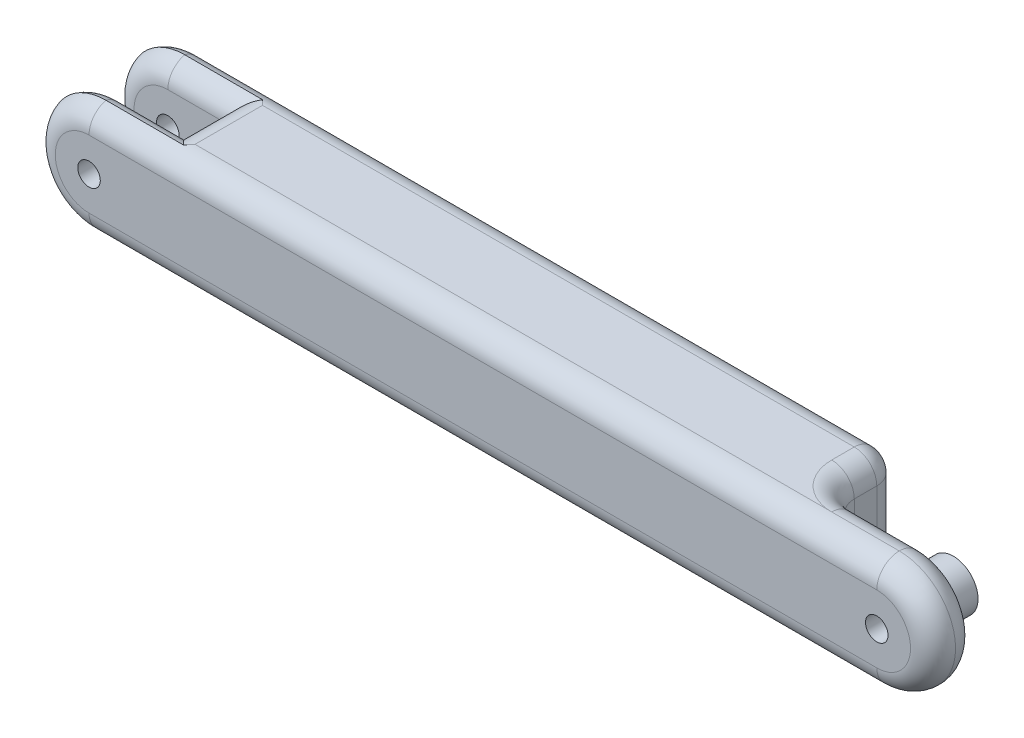
ISO-10303-21;
HEADER;
FILE_DESCRIPTION(('STEP AP214'),'2;1');
FILE_NAME('part.step','',(''),(''),'','','');
FILE_SCHEMA(('AUTOMOTIVE_DESIGN { 1 0 10303 214 1 1 1 1 }'));
ENDSEC;
DATA;
#1=APPLICATION_CONTEXT('core data for automotive mechanical design processes');
#2=APPLICATION_PROTOCOL_DEFINITION('international standard','automotive_design',2000,#1);
#3=PRODUCT_CONTEXT('',#1,'mechanical');
#4=PRODUCT('Part','Part','',(#3));
#5=PRODUCT_RELATED_PRODUCT_CATEGORY('part','',(#4));
#6=PRODUCT_DEFINITION_FORMATION('','',#4);
#7=PRODUCT_DEFINITION_CONTEXT('part definition',#1,'design');
#8=PRODUCT_DEFINITION('design','',#6,#7);
#9=PRODUCT_DEFINITION_SHAPE('','',#8);
#10=(LENGTH_UNIT() NAMED_UNIT(*) SI_UNIT(.MILLI.,.METRE.));
#11=(NAMED_UNIT(*) PLANE_ANGLE_UNIT() SI_UNIT($,.RADIAN.));
#12=(NAMED_UNIT(*) SI_UNIT($,.STERADIAN.) SOLID_ANGLE_UNIT());
#13=UNCERTAINTY_MEASURE_WITH_UNIT(LENGTH_MEASURE(1.E-05),#10,'distance_accuracy_value','');
#14=(GEOMETRIC_REPRESENTATION_CONTEXT(3) GLOBAL_UNCERTAINTY_ASSIGNED_CONTEXT((#13)) GLOBAL_UNIT_ASSIGNED_CONTEXT((#10,
#11,#12)) REPRESENTATION_CONTEXT('',''));
#15=CARTESIAN_POINT('',(0.,0.,0.));
#16=DIRECTION('',(0.,0.,1.));
#17=DIRECTION('',(1.,0.,0.));
#18=AXIS2_PLACEMENT_3D('',#15,#16,#17);
#19=CARTESIAN_POINT('',(0.,0.,3.));
#20=DIRECTION('',(0.,0.,-1.));
#21=DIRECTION('',(-1.,0.,0.));
#22=AXIS2_PLACEMENT_3D('',#19,#20,#21);
#23=PLANE('',#22);
#24=DIRECTION('',(0.,1.,0.));
#25=VECTOR('',#24,1.);
#26=CARTESIAN_POINT('',(18.5,0.,3.));
#27=LINE('',#26,#25);
#28=CARTESIAN_POINT('',(18.5,-1.5,3.));
#29=VERTEX_POINT('',#28);
#30=CARTESIAN_POINT('',(18.5,1.5,3.));
#31=VERTEX_POINT('',#30);
#32=EDGE_CURVE('E410',#29,#31,#27,.T.);
#33=ORIENTED_EDGE('',*,*,#32,.T.);
#34=DIRECTION('',(1.,0.,0.));
#35=VECTOR('',#34,1.);
#36=CARTESIAN_POINT('',(21.5,1.5,3.));
#37=LINE('',#36,#35);
#38=CARTESIAN_POINT('',(21.5,1.5,3.));
#39=VERTEX_POINT('',#38);
#40=EDGE_CURVE('E416',#31,#39,#37,.T.);
#41=ORIENTED_EDGE('',*,*,#40,.T.);
#42=CARTESIAN_POINT('',(21.5,0.,3.));
#43=DIRECTION('',(0.,0.,-1.));
#44=DIRECTION('',(-1.,0.,0.));
#45=AXIS2_PLACEMENT_3D('',#42,#43,#44);
#46=CIRCLE('',#45,1.5);
#47=CARTESIAN_POINT('',(21.5,-1.5,3.));
#48=VERTEX_POINT('',#47);
#49=EDGE_CURVE('E414',#39,#48,#46,.T.);
#50=ORIENTED_EDGE('',*,*,#49,.T.);
#51=DIRECTION('',(-1.,0.,0.));
#52=VECTOR('',#51,1.);
#53=CARTESIAN_POINT('',(17.5,-1.5,3.));
#54=LINE('',#53,#52);
#55=EDGE_CURVE('E412',#48,#29,#54,.T.);
#56=ORIENTED_EDGE('',*,*,#55,.T.);
#57=EDGE_LOOP('',(#33,#41,#50,#56));
#58=FACE_BOUND('',#57,.T.);
#59=CARTESIAN_POINT('',(21.5,0.,3.));
#60=DIRECTION('',(0.,0.,-1.));
#61=DIRECTION('',(-1.,0.,0.));
#62=AXIS2_PLACEMENT_3D('',#59,#60,#61);
#63=CIRCLE('',#62,1.1);
#64=CARTESIAN_POINT('',(20.4,0.,3.));
#65=VERTEX_POINT('',#64);
#66=EDGE_CURVE('E362',#65,#65,#63,.T.);
#67=ORIENTED_EDGE('',*,*,#66,.F.);
#68=EDGE_LOOP('',(#67));
#69=FACE_BOUND('',#68,.T.);
#70=ADVANCED_FACE('F37',(#58,#69),#23,.T.);
#71=CARTESIAN_POINT('',(21.5,0.,5.));
#72=DIRECTION('',(0.,0.,-1.));
#73=DIRECTION('',(-1.,0.,0.));
#74=AXIS2_PLACEMENT_3D('',#71,#72,#73);
#75=CYLINDRICAL_SURFACE('',#74,0.499999999999999);
#76=CARTESIAN_POINT('',(21.5,0.,5.));
#77=DIRECTION('',(0.,0.,1.));
#78=DIRECTION('',(1.,0.,0.));
#79=AXIS2_PLACEMENT_3D('',#76,#77,#78);
#80=CIRCLE('',#79,0.499999999999999);
#81=CARTESIAN_POINT('',(22.,0.,5.));
#82=VERTEX_POINT('',#81);
#83=EDGE_CURVE('E377',#82,#82,#80,.T.);
#84=ORIENTED_EDGE('',*,*,#83,.T.);
#85=EDGE_LOOP('',(#84));
#86=FACE_BOUND('',#85,.T.);
#87=CARTESIAN_POINT('',(21.5,0.,1.6));
#88=DIRECTION('',(0.,0.,-1.));
#89=DIRECTION('',(-1.,0.,0.));
#90=AXIS2_PLACEMENT_3D('',#87,#88,#89);
#91=CIRCLE('',#90,0.499999999999999);
#92=CARTESIAN_POINT('',(21.,0.,1.6));
#93=VERTEX_POINT('',#92);
#94=EDGE_CURVE('E360',#93,#93,#91,.T.);
#95=ORIENTED_EDGE('',*,*,#94,.T.);
#96=EDGE_LOOP('',(#95));
#97=FACE_BOUND('',#96,.T.);
#98=ADVANCED_FACE('F529',(#86,#97),#75,.F.);
#99=CARTESIAN_POINT('',(-13.5,0.,5.));
#100=DIRECTION('',(0.,0.,-1.));
#101=DIRECTION('',(-1.,0.,0.));
#102=AXIS2_PLACEMENT_3D('',#99,#100,#101);
#103=CYLINDRICAL_SURFACE('',#102,0.500000000000001);
#104=CARTESIAN_POINT('',(-13.5,0.,5.));
#105=DIRECTION('',(0.,0.,1.));
#106=DIRECTION('',(1.,0.,0.));
#107=AXIS2_PLACEMENT_3D('',#104,#105,#106);
#108=CIRCLE('',#107,0.500000000000001);
#109=CARTESIAN_POINT('',(-13.,0.,5.));
#110=VERTEX_POINT('',#109);
#111=EDGE_CURVE('E382',#110,#110,#108,.T.);
#112=ORIENTED_EDGE('',*,*,#111,.T.);
#113=EDGE_LOOP('',(#112));
#114=FACE_BOUND('',#113,.T.);
#115=CARTESIAN_POINT('',(-13.5,0.,3.5));
#116=DIRECTION('',(0.,0.,-1.));
#117=DIRECTION('',(-1.,0.,0.));
#118=AXIS2_PLACEMENT_3D('',#115,#116,#117);
#119=CIRCLE('',#118,0.500000000000001);
#120=CARTESIAN_POINT('',(-14.,0.,3.5));
#121=VERTEX_POINT('',#120);
#122=EDGE_CURVE('E376',#121,#121,#119,.T.);
#123=ORIENTED_EDGE('',*,*,#122,.T.);
#124=EDGE_LOOP('',(#123));
#125=FACE_BOUND('',#124,.T.);
#126=ADVANCED_FACE('F535',(#114,#125),#103,.F.);
#127=CARTESIAN_POINT('',(21.5,0.,5.));
#128=DIRECTION('',(0.,0.,1.));
#129=DIRECTION('',(1.,0.,0.));
#130=AXIS2_PLACEMENT_3D('',#127,#128,#129);
#131=PLANE('',#130);
#132=DIRECTION('',(-1.,0.,0.));
#133=VECTOR('',#132,1.);
#134=CARTESIAN_POINT('',(-13.5,1.5,5.));
#135=LINE('',#134,#133);
#136=CARTESIAN_POINT('',(21.5,1.5,5.));
#137=VERTEX_POINT('',#136);
#138=CARTESIAN_POINT('',(-13.5,1.5,5.));
#139=VERTEX_POINT('',#138);
#140=EDGE_CURVE('E435',#137,#139,#135,.T.);
#141=ORIENTED_EDGE('',*,*,#140,.T.);
#142=CARTESIAN_POINT('',(-13.5,0.,5.));
#143=DIRECTION('',(0.,0.,1.));
#144=DIRECTION('',(1.,0.,0.));
#145=AXIS2_PLACEMENT_3D('',#142,#143,#144);
#146=CIRCLE('',#145,1.5);
#147=CARTESIAN_POINT('',(-13.5,-1.5,5.));
#148=VERTEX_POINT('',#147);
#149=EDGE_CURVE('E437',#139,#148,#146,.T.);
#150=ORIENTED_EDGE('',*,*,#149,.T.);
#151=DIRECTION('',(1.,0.,0.));
#152=VECTOR('',#151,1.);
#153=CARTESIAN_POINT('',(21.5,-1.5,5.));
#154=LINE('',#153,#152);
#155=CARTESIAN_POINT('',(21.5,-1.5,5.));
#156=VERTEX_POINT('',#155);
#157=EDGE_CURVE('E431',#148,#156,#154,.T.);
#158=ORIENTED_EDGE('',*,*,#157,.T.);
#159=CARTESIAN_POINT('',(21.5,0.,5.));
#160=DIRECTION('',(0.,0.,1.));
#161=DIRECTION('',(1.,0.,0.));
#162=AXIS2_PLACEMENT_3D('',#159,#160,#161);
#163=CIRCLE('',#162,1.5);
#164=EDGE_CURVE('E433',#156,#137,#163,.T.);
#165=ORIENTED_EDGE('',*,*,#164,.T.);
#166=EDGE_LOOP('',(#141,#150,#158,#165));
#167=FACE_BOUND('',#166,.T.);
#168=ORIENTED_EDGE('',*,*,#111,.F.);
#169=EDGE_LOOP('',(#168));
#170=FACE_BOUND('',#169,.T.);
#171=ORIENTED_EDGE('',*,*,#83,.F.);
#172=EDGE_LOOP('',(#171));
#173=FACE_BOUND('',#172,.T.);
#174=ADVANCED_FACE('F503',(#167,#170,#173),#131,.T.);
#175=CARTESIAN_POINT('',(21.5,0.,0.));
#176=DIRECTION('',(0.,0.,1.));
#177=DIRECTION('',(1.,0.,0.));
#178=AXIS2_PLACEMENT_3D('',#175,#176,#177);
#179=PLANE('',#178);
#180=CARTESIAN_POINT('',(-13.5,0.,0.));
#181=DIRECTION('',(0.,0.,1.));
#182=DIRECTION('',(1.,0.,0.));
#183=AXIS2_PLACEMENT_3D('',#180,#181,#182);
#184=CIRCLE('',#183,1.5);
#185=CARTESIAN_POINT('',(-13.5,-1.5,0.));
#186=VERTEX_POINT('',#185);
#187=CARTESIAN_POINT('',(-13.5,1.5,0.));
#188=VERTEX_POINT('',#187);
#189=EDGE_CURVE('E444',#186,#188,#184,.F.);
#190=ORIENTED_EDGE('',*,*,#189,.T.);
#191=DIRECTION('',(-1.,0.,0.));
#192=VECTOR('',#191,1.);
#193=CARTESIAN_POINT('',(21.5,1.5,0.));
#194=LINE('',#193,#192);
#195=CARTESIAN_POINT('',(16.5,1.5,0.));
#196=VERTEX_POINT('',#195);
#197=EDGE_CURVE('E446',#188,#196,#194,.F.);
#198=ORIENTED_EDGE('',*,*,#197,.T.);
#199=DIRECTION('',(0.,1.,0.));
#200=VECTOR('',#199,1.);
#201=CARTESIAN_POINT('',(16.5,0.,0.));
#202=LINE('',#201,#200);
#203=CARTESIAN_POINT('',(16.5,-1.5,0.));
#204=VERTEX_POINT('',#203);
#205=EDGE_CURVE('E440',#196,#204,#202,.F.);
#206=ORIENTED_EDGE('',*,*,#205,.T.);
#207=DIRECTION('',(1.,0.,0.));
#208=VECTOR('',#207,1.);
#209=CARTESIAN_POINT('',(21.5,-1.5,0.));
#210=LINE('',#209,#208);
#211=EDGE_CURVE('E442',#204,#186,#210,.F.);
#212=ORIENTED_EDGE('',*,*,#211,.T.);
#213=EDGE_LOOP('',(#190,#198,#206,#212));
#214=FACE_BOUND('',#213,.T.);
#215=CARTESIAN_POINT('',(-13.5,0.,0.));
#216=DIRECTION('',(0.,0.,1.));
#217=DIRECTION('',(1.,0.,0.));
#218=AXIS2_PLACEMENT_3D('',#215,#216,#217);
#219=CIRCLE('',#218,0.500000000000001);
#220=CARTESIAN_POINT('',(-13.,0.,0.));
#221=VERTEX_POINT('',#220);
#222=EDGE_CURVE('E380',#221,#221,#219,.T.);
#223=ORIENTED_EDGE('',*,*,#222,.T.);
#224=EDGE_LOOP('',(#223));
#225=FACE_BOUND('',#224,.T.);
#226=ADVANCED_FACE('F560',(#214,#225),#179,.F.);
#227=CARTESIAN_POINT('',(-13.5,2.5,5.));
#228=DIRECTION('',(0.,-1.,0.));
#229=DIRECTION('',(1.,0.,0.));
#230=AXIS2_PLACEMENT_3D('',#227,#228,#229);
#231=PLANE('',#230);
#232=CARTESIAN_POINT('',(18.5,2.5,2.));
#233=DIRECTION('',(0.,-1.,0.));
#234=DIRECTION('',(1.,0.,0.));
#235=AXIS2_PLACEMENT_3D('',#232,#233,#234);
#236=CIRCLE('',#235,2.);
#237=CARTESIAN_POINT('',(16.5,2.5,2.));
#238=VERTEX_POINT('',#237);
#239=CARTESIAN_POINT('',(18.5,2.5,4.));
#240=VERTEX_POINT('',#239);
#241=EDGE_CURVE('E396',#238,#240,#236,.F.);
#242=ORIENTED_EDGE('',*,*,#241,.F.);
#243=DIRECTION('',(0.,0.,-1.));
#244=VECTOR('',#243,1.);
#245=CARTESIAN_POINT('',(16.5,2.5,5.));
#246=LINE('',#245,#244);
#247=CARTESIAN_POINT('',(16.5,2.5,1.));
#248=VERTEX_POINT('',#247);
#249=EDGE_CURVE('E399',#238,#248,#246,.T.);
#250=ORIENTED_EDGE('',*,*,#249,.T.);
#251=DIRECTION('',(-1.,0.,0.));
#252=VECTOR('',#251,1.);
#253=CARTESIAN_POINT('',(-13.5,2.5,1.));
#254=LINE('',#253,#252);
#255=CARTESIAN_POINT('',(-9.79190075645216,2.5,1.));
#256=VERTEX_POINT('',#255);
#257=EDGE_CURVE('E104',#248,#256,#254,.T.);
#258=ORIENTED_EDGE('',*,*,#257,.T.);
#259=DIRECTION('',(0.,0.,-1.));
#260=VECTOR('',#259,1.);
#261=CARTESIAN_POINT('',(-9.79190075645216,2.5,3.5));
#262=LINE('',#261,#260);
#263=CARTESIAN_POINT('',(-9.79190075645216,2.5,4.));
#264=VERTEX_POINT('',#263);
#265=EDGE_CURVE('E385',#256,#264,#262,.F.);
#266=ORIENTED_EDGE('',*,*,#265,.T.);
#267=DIRECTION('',(-1.,0.,0.));
#268=VECTOR('',#267,1.);
#269=CARTESIAN_POINT('',(21.5,2.5,4.));
#270=LINE('',#269,#268);
#271=EDGE_CURVE('E394',#264,#240,#270,.F.);
#272=ORIENTED_EDGE('',*,*,#271,.T.);
#273=EDGE_LOOP('',(#242,#250,#258,#266,#272));
#274=FACE_BOUND('',#273,.T.);
#275=ADVANCED_FACE('F563',(#274),#231,.F.);
#276=CARTESIAN_POINT('',(-13.5,-2.5,5.));
#277=DIRECTION('',(0.,1.,0.));
#278=DIRECTION('',(0.,0.,1.));
#279=AXIS2_PLACEMENT_3D('',#276,#277,#278);
#280=PLANE('',#279);
#281=CARTESIAN_POINT('',(18.5,-2.5,2.));
#282=DIRECTION('',(0.,1.,0.));
#283=DIRECTION('',(0.,0.,1.));
#284=AXIS2_PLACEMENT_3D('',#281,#282,#283);
#285=CIRCLE('',#284,2.);
#286=CARTESIAN_POINT('',(18.5,-2.5,4.));
#287=VERTEX_POINT('',#286);
#288=CARTESIAN_POINT('',(16.5,-2.5,2.));
#289=VERTEX_POINT('',#288);
#290=EDGE_CURVE('E460',#287,#289,#285,.F.);
#291=ORIENTED_EDGE('',*,*,#290,.F.);
#292=DIRECTION('',(1.,0.,0.));
#293=VECTOR('',#292,1.);
#294=CARTESIAN_POINT('',(-13.5,-2.5,4.));
#295=LINE('',#294,#293);
#296=CARTESIAN_POINT('',(-9.79190075645215,-2.5,4.));
#297=VERTEX_POINT('',#296);
#298=EDGE_CURVE('E249',#287,#297,#295,.F.);
#299=ORIENTED_EDGE('',*,*,#298,.T.);
#300=DIRECTION('',(0.,0.,-1.));
#301=VECTOR('',#300,1.);
#302=CARTESIAN_POINT('',(-9.79190075645215,-2.5,1.5));
#303=LINE('',#302,#301);
#304=CARTESIAN_POINT('',(-9.79190075645215,-2.5,1.));
#305=VERTEX_POINT('',#304);
#306=EDGE_CURVE('E457',#297,#305,#303,.T.);
#307=ORIENTED_EDGE('',*,*,#306,.T.);
#308=DIRECTION('',(1.,0.,0.));
#309=VECTOR('',#308,1.);
#310=CARTESIAN_POINT('',(-13.5,-2.5,1.));
#311=LINE('',#310,#309);
#312=CARTESIAN_POINT('',(16.5,-2.5,1.));
#313=VERTEX_POINT('',#312);
#314=EDGE_CURVE('E453',#305,#313,#311,.T.);
#315=ORIENTED_EDGE('',*,*,#314,.T.);
#316=DIRECTION('',(0.,0.,-1.));
#317=VECTOR('',#316,1.);
#318=CARTESIAN_POINT('',(16.5,-2.5,5.));
#319=LINE('',#318,#317);
#320=EDGE_CURVE('E455',#313,#289,#319,.F.);
#321=ORIENTED_EDGE('',*,*,#320,.T.);
#322=EDGE_LOOP('',(#291,#299,#307,#315,#321));
#323=FACE_BOUND('',#322,.T.);
#324=ADVANCED_FACE('F464',(#323),#280,.F.);
#325=CARTESIAN_POINT('',(-13.5,0.,1.5));
#326=DIRECTION('',(0.,0.,-1.));
#327=DIRECTION('',(-1.,0.,0.));
#328=AXIS2_PLACEMENT_3D('',#325,#326,#327);
#329=CIRCLE('',#328,0.500000000000001);
#330=CARTESIAN_POINT('',(-14.,0.,1.5));
#331=VERTEX_POINT('',#330);
#332=EDGE_CURVE('E381',#331,#331,#329,.T.);
#333=ORIENTED_EDGE('',*,*,#332,.F.);
#334=EDGE_LOOP('',(#333));
#335=FACE_BOUND('',#334,.T.);
#336=ORIENTED_EDGE('',*,*,#222,.F.);
#337=EDGE_LOOP('',(#336));
#338=FACE_BOUND('',#337,.T.);
#339=ADVANCED_FACE('F552',(#335,#338),#103,.F.);
#340=CARTESIAN_POINT('',(-13.5,0.,1.5));
#341=DIRECTION('',(0.,0.,1.));
#342=DIRECTION('',(1.,0.,0.));
#343=AXIS2_PLACEMENT_3D('',#340,#341,#342);
#344=CYLINDRICAL_SURFACE('',#343,3.);
#345=CARTESIAN_POINT('',(-13.5,0.,3.5));
#346=DIRECTION('',(0.,0.,-1.));
#347=DIRECTION('',(-1.,0.,0.));
#348=AXIS2_PLACEMENT_3D('',#345,#346,#347);
#349=CIRCLE('',#348,3.);
#350=CARTESIAN_POINT('',(-10.7189255673391,1.125,3.5));
#351=VERTEX_POINT('',#350);
#352=CARTESIAN_POINT('',(-10.7189255673391,-1.125,3.5));
#353=VERTEX_POINT('',#352);
#354=EDGE_CURVE('E371',#351,#353,#349,.T.);
#355=ORIENTED_EDGE('',*,*,#354,.F.);
#356=DIRECTION('',(0.,0.,1.));
#357=VECTOR('',#356,1.);
#358=CARTESIAN_POINT('',(-10.7189255673391,1.125,1.5));
#359=LINE('',#358,#357);
#360=CARTESIAN_POINT('',(-10.7189255673391,1.125,1.5));
#361=VERTEX_POINT('',#360);
#362=EDGE_CURVE('E451',#351,#361,#359,.F.);
#363=ORIENTED_EDGE('',*,*,#362,.T.);
#364=CARTESIAN_POINT('',(-13.5,0.,1.5));
#365=DIRECTION('',(0.,0.,-1.));
#366=DIRECTION('',(-1.,0.,0.));
#367=AXIS2_PLACEMENT_3D('',#364,#365,#366);
#368=CIRCLE('',#367,3.);
#369=CARTESIAN_POINT('',(-10.7189255673391,-1.125,1.5));
#370=VERTEX_POINT('',#369);
#371=EDGE_CURVE('E226',#361,#370,#368,.T.);
#372=ORIENTED_EDGE('',*,*,#371,.T.);
#373=DIRECTION('',(0.,0.,1.));
#374=VECTOR('',#373,1.);
#375=CARTESIAN_POINT('',(-10.7189255673391,-1.125,1.5));
#376=LINE('',#375,#374);
#377=EDGE_CURVE('E449',#370,#353,#376,.T.);
#378=ORIENTED_EDGE('',*,*,#377,.T.);
#379=EDGE_LOOP('',(#355,#363,#372,#378));
#380=FACE_BOUND('',#379,.T.);
#381=ADVANCED_FACE('F549',(#380),#344,.F.);
#382=CARTESIAN_POINT('',(-13.5,0.,1.5));
#383=DIRECTION('',(0.,0.,-1.));
#384=DIRECTION('',(-1.,0.,0.));
#385=AXIS2_PLACEMENT_3D('',#382,#383,#384);
#386=PLANE('',#385);
#387=ORIENTED_EDGE('',*,*,#332,.T.);
#388=EDGE_LOOP('',(#387));
#389=FACE_BOUND('',#388,.T.);
#390=CARTESIAN_POINT('',(-13.5,0.,1.5));
#391=DIRECTION('',(0.,0.,-1.));
#392=DIRECTION('',(-1.,0.,0.));
#393=AXIS2_PLACEMENT_3D('',#390,#391,#392);
#394=CIRCLE('',#393,1.5);
#395=CARTESIAN_POINT('',(-13.5,1.5,1.5));
#396=VERTEX_POINT('',#395);
#397=CARTESIAN_POINT('',(-13.5,-1.5,1.5));
#398=VERTEX_POINT('',#397);
#399=EDGE_CURVE('E419',#396,#398,#394,.F.);
#400=ORIENTED_EDGE('',*,*,#399,.T.);
#401=DIRECTION('',(-1.,0.,0.));
#402=VECTOR('',#401,1.);
#403=CARTESIAN_POINT('',(-13.5,-1.5,1.5));
#404=LINE('',#403,#402);
#405=CARTESIAN_POINT('',(-10.9019237886467,-1.5,1.5));
#406=VERTEX_POINT('',#405);
#407=EDGE_CURVE('E422',#398,#406,#404,.F.);
#408=ORIENTED_EDGE('',*,*,#407,.T.);
#409=DIRECTION('',(-1.,0.,0.));
#410=VECTOR('',#409,1.);
#411=CARTESIAN_POINT('',(-13.5,-1.5,1.5));
#412=LINE('',#411,#410);
#413=CARTESIAN_POINT('',(-10.7919007564522,-1.5,1.5));
#414=VERTEX_POINT('',#413);
#415=EDGE_CURVE('E246',#406,#414,#412,.F.);
#416=ORIENTED_EDGE('',*,*,#415,.T.);
#417=CARTESIAN_POINT('',(-9.79190075645215,-1.5,1.5));
#418=DIRECTION('',(0.,0.,-1.));
#419=DIRECTION('',(-1.,0.,0.));
#420=AXIS2_PLACEMENT_3D('',#417,#418,#419);
#421=CIRCLE('',#420,1.);
#422=EDGE_CURVE('E11',#414,#370,#421,.T.);
#423=ORIENTED_EDGE('',*,*,#422,.T.);
#424=ORIENTED_EDGE('',*,*,#371,.F.);
#425=CARTESIAN_POINT('',(-9.79190075645216,1.5,1.5));
#426=DIRECTION('',(0.,0.,-1.));
#427=DIRECTION('',(-1.,0.,0.));
#428=AXIS2_PLACEMENT_3D('',#425,#426,#427);
#429=CIRCLE('',#428,1.);
#430=CARTESIAN_POINT('',(-10.7919007564522,1.5,1.5));
#431=VERTEX_POINT('',#430);
#432=EDGE_CURVE('E219',#361,#431,#429,.T.);
#433=ORIENTED_EDGE('',*,*,#432,.T.);
#434=DIRECTION('',(1.,0.,0.));
#435=VECTOR('',#434,1.);
#436=CARTESIAN_POINT('',(-13.5,1.5,1.5));
#437=LINE('',#436,#435);
#438=CARTESIAN_POINT('',(-10.9019237886467,1.5,1.5));
#439=VERTEX_POINT('',#438);
#440=EDGE_CURVE('E223',#431,#439,#437,.F.);
#441=ORIENTED_EDGE('',*,*,#440,.T.);
#442=DIRECTION('',(1.,0.,0.));
#443=VECTOR('',#442,1.);
#444=CARTESIAN_POINT('',(-13.5,1.5,1.5));
#445=LINE('',#444,#443);
#446=EDGE_CURVE('E244',#439,#396,#445,.F.);
#447=ORIENTED_EDGE('',*,*,#446,.T.);
#448=EDGE_LOOP('',(#400,#408,#416,#423,#424,#433,#441,#447));
#449=FACE_BOUND('',#448,.T.);
#450=ADVANCED_FACE('F221',(#389,#449),#386,.F.);
#451=CARTESIAN_POINT('',(-13.5,0.,3.5));
#452=DIRECTION('',(0.,0.,-1.));
#453=DIRECTION('',(-1.,0.,0.));
#454=AXIS2_PLACEMENT_3D('',#451,#452,#453);
#455=PLANE('',#454);
#456=ORIENTED_EDGE('',*,*,#354,.T.);
#457=CARTESIAN_POINT('',(-9.79190075645215,-1.5,3.5));
#458=DIRECTION('',(0.,0.,-1.));
#459=DIRECTION('',(-1.,0.,0.));
#460=AXIS2_PLACEMENT_3D('',#457,#458,#459);
#461=CIRCLE('',#460,1.);
#462=CARTESIAN_POINT('',(-10.7919007564522,-1.5,3.5));
#463=VERTEX_POINT('',#462);
#464=EDGE_CURVE('E47',#353,#463,#461,.F.);
#465=ORIENTED_EDGE('',*,*,#464,.T.);
#466=DIRECTION('',(-1.,0.,0.));
#467=VECTOR('',#466,1.);
#468=CARTESIAN_POINT('',(-13.5,-1.5,3.5));
#469=LINE('',#468,#467);
#470=CARTESIAN_POINT('',(-10.9019237886467,-1.5,3.5));
#471=VERTEX_POINT('',#470);
#472=EDGE_CURVE('E245',#463,#471,#469,.T.);
#473=ORIENTED_EDGE('',*,*,#472,.T.);
#474=DIRECTION('',(-1.,0.,0.));
#475=VECTOR('',#474,1.);
#476=CARTESIAN_POINT('',(-13.5,-1.5,3.5));
#477=LINE('',#476,#475);
#478=CARTESIAN_POINT('',(-13.5,-1.5,3.5));
#479=VERTEX_POINT('',#478);
#480=EDGE_CURVE('E429',#471,#479,#477,.T.);
#481=ORIENTED_EDGE('',*,*,#480,.T.);
#482=CARTESIAN_POINT('',(-13.5,0.,3.5));
#483=DIRECTION('',(0.,0.,-1.));
#484=DIRECTION('',(-1.,0.,0.));
#485=AXIS2_PLACEMENT_3D('',#482,#483,#484);
#486=CIRCLE('',#485,1.5);
#487=CARTESIAN_POINT('',(-13.5,1.5,3.5));
#488=VERTEX_POINT('',#487);
#489=EDGE_CURVE('E425',#479,#488,#486,.T.);
#490=ORIENTED_EDGE('',*,*,#489,.T.);
#491=DIRECTION('',(1.,0.,0.));
#492=VECTOR('',#491,1.);
#493=CARTESIAN_POINT('',(-11.8416876048223,1.5,3.5));
#494=LINE('',#493,#492);
#495=CARTESIAN_POINT('',(-10.9019237886467,1.5,3.5));
#496=VERTEX_POINT('',#495);
#497=EDGE_CURVE('E427',#488,#496,#494,.T.);
#498=ORIENTED_EDGE('',*,*,#497,.T.);
#499=DIRECTION('',(1.,0.,0.));
#500=VECTOR('',#499,1.);
#501=CARTESIAN_POINT('',(-11.8416876048223,1.5,3.5));
#502=LINE('',#501,#500);
#503=CARTESIAN_POINT('',(-10.7919007564522,1.5,3.5));
#504=VERTEX_POINT('',#503);
#505=EDGE_CURVE('E56',#496,#504,#502,.T.);
#506=ORIENTED_EDGE('',*,*,#505,.T.);
#507=CARTESIAN_POINT('',(-9.79190075645216,1.5,3.5));
#508=DIRECTION('',(0.,0.,-1.));
#509=DIRECTION('',(-1.,0.,0.));
#510=AXIS2_PLACEMENT_3D('',#507,#508,#509);
#511=CIRCLE('',#510,1.);
#512=EDGE_CURVE('E229',#504,#351,#511,.F.);
#513=ORIENTED_EDGE('',*,*,#512,.T.);
#514=EDGE_LOOP('',(#456,#465,#473,#481,#490,#498,#506,#513));
#515=FACE_BOUND('',#514,.T.);
#516=ORIENTED_EDGE('',*,*,#122,.F.);
#517=EDGE_LOOP('',(#516));
#518=FACE_BOUND('',#517,.T.);
#519=ADVANCED_FACE('F515',(#515,#518),#455,.T.);
#520=CARTESIAN_POINT('',(17.5,2.5,3.));
#521=DIRECTION('',(-1.,0.,0.));
#522=DIRECTION('',(0.,0.,1.));
#523=AXIS2_PLACEMENT_3D('',#520,#521,#522);
#524=PLANE('',#523);
#525=DIRECTION('',(0.,0.,-1.));
#526=VECTOR('',#525,1.);
#527=CARTESIAN_POINT('',(17.5,1.5,3.));
#528=LINE('',#527,#526);
#529=CARTESIAN_POINT('',(17.5,1.5,1.));
#530=VERTEX_POINT('',#529);
#531=CARTESIAN_POINT('',(17.5,1.5,2.));
#532=VERTEX_POINT('',#531);
#533=EDGE_CURVE('E405',#530,#532,#528,.F.);
#534=ORIENTED_EDGE('',*,*,#533,.T.);
#535=DIRECTION('',(0.,1.,0.));
#536=VECTOR('',#535,1.);
#537=CARTESIAN_POINT('',(17.5,2.5,2.));
#538=LINE('',#537,#536);
#539=CARTESIAN_POINT('',(17.5,-1.5,2.));
#540=VERTEX_POINT('',#539);
#541=EDGE_CURVE('E408',#532,#540,#538,.F.);
#542=ORIENTED_EDGE('',*,*,#541,.T.);
#543=DIRECTION('',(0.,0.,-1.));
#544=VECTOR('',#543,1.);
#545=CARTESIAN_POINT('',(17.5,-1.5,3.));
#546=LINE('',#545,#544);
#547=CARTESIAN_POINT('',(17.5,-1.5,1.));
#548=VERTEX_POINT('',#547);
#549=EDGE_CURVE('E403',#540,#548,#546,.T.);
#550=ORIENTED_EDGE('',*,*,#549,.T.);
#551=DIRECTION('',(0.,1.,0.));
#552=VECTOR('',#551,1.);
#553=CARTESIAN_POINT('',(17.5,2.5,1.));
#554=LINE('',#553,#552);
#555=EDGE_CURVE('E401',#548,#530,#554,.T.);
#556=ORIENTED_EDGE('',*,*,#555,.T.);
#557=EDGE_LOOP('',(#534,#542,#550,#556));
#558=FACE_BOUND('',#557,.T.);
#559=ADVANCED_FACE('F541',(#558),#524,.F.);
#560=CARTESIAN_POINT('',(21.5,0.,1.6));
#561=DIRECTION('',(0.,0.,-1.));
#562=DIRECTION('',(-1.,0.,0.));
#563=AXIS2_PLACEMENT_3D('',#560,#561,#562);
#564=PLANE('',#563);
#565=CARTESIAN_POINT('',(21.5,0.,1.6));
#566=DIRECTION('',(0.,0.,-1.));
#567=DIRECTION('',(-1.,0.,0.));
#568=AXIS2_PLACEMENT_3D('',#565,#566,#567);
#569=CIRCLE('',#568,1.1);
#570=CARTESIAN_POINT('',(20.4,0.,1.6));
#571=VERTEX_POINT('',#570);
#572=EDGE_CURVE('E367',#571,#571,#569,.T.);
#573=ORIENTED_EDGE('',*,*,#572,.T.);
#574=EDGE_LOOP('',(#573));
#575=FACE_BOUND('',#574,.T.);
#576=ORIENTED_EDGE('',*,*,#94,.F.);
#577=EDGE_LOOP('',(#576));
#578=FACE_BOUND('',#577,.T.);
#579=ADVANCED_FACE('F525',(#575,#578),#564,.T.);
#580=CARTESIAN_POINT('',(21.5,0.,1.6));
#581=DIRECTION('',(0.,0.,1.));
#582=DIRECTION('',(1.,0.,0.));
#583=AXIS2_PLACEMENT_3D('',#580,#581,#582);
#584=CYLINDRICAL_SURFACE('',#583,1.1);
#585=ORIENTED_EDGE('',*,*,#572,.F.);
#586=EDGE_LOOP('',(#585));
#587=FACE_BOUND('',#586,.T.);
#588=ORIENTED_EDGE('',*,*,#66,.T.);
#589=EDGE_LOOP('',(#588));
#590=FACE_BOUND('',#589,.T.);
#591=ADVANCED_FACE('F520',(#587,#590),#584,.T.);
#592=CARTESIAN_POINT('',(-13.5,-1.5,4.5));
#593=DIRECTION('',(1.,0.,0.));
#594=DIRECTION('',(0.,0.,-1.));
#595=AXIS2_PLACEMENT_3D('',#592,#593,#594);
#596=CYLINDRICAL_SURFACE('',#595,1.);
#597=DIRECTION('',(1.,0.,0.));
#598=VECTOR('',#597,1.);
#599=CARTESIAN_POINT('',(-11.6348260804954,-2.46824583655185,4.25));
#600=LINE('',#599,#598);
#601=CARTESIAN_POINT('',(-13.5,-2.46824583655185,4.25));
#602=VERTEX_POINT('',#601);
#603=CARTESIAN_POINT('',(-10.0419007564522,-2.46824583655185,4.25));
#604=VERTEX_POINT('',#603);
#605=EDGE_CURVE('E41',#602,#604,#600,.T.);
#606=ORIENTED_EDGE('',*,*,#605,.F.);
#607=CARTESIAN_POINT('',(-13.5,-1.5,4.5));
#608=DIRECTION('',(-1.,0.,0.));
#609=DIRECTION('',(0.,0.,1.));
#610=AXIS2_PLACEMENT_3D('',#607,#608,#609);
#611=CIRCLE('',#610,1.);
#612=EDGE_CURVE('E357',#479,#602,#611,.T.);
#613=ORIENTED_EDGE('',*,*,#612,.F.);
#614=ORIENTED_EDGE('',*,*,#480,.F.);
#615=ORIENTED_EDGE('',*,*,#472,.F.);
#616=CARTESIAN_POINT('',(-9.79190075645215,-1.5,4.5));
#617=DIRECTION('',(0.707106781186547,0.,-0.707106781186547));
#618=DIRECTION('',(0.707106781186547,0.,0.707106781186547));
#619=AXIS2_PLACEMENT_3D('',#616,#617,#618);
#620=ELLIPSE('',#619,1.41421356237309,1.);
#621=EDGE_CURVE('E353',#604,#463,#620,.T.);
#622=ORIENTED_EDGE('',*,*,#621,.F.);
#623=EDGE_LOOP('',(#606,#613,#614,#615,#622));
#624=FACE_BOUND('',#623,.T.);
#625=ADVANCED_FACE('F39',(#624),#596,.T.);
#626=CARTESIAN_POINT('',(21.5,-1.5,4.));
#627=DIRECTION('',(-1.,0.,0.));
#628=DIRECTION('',(0.,0.,1.));
#629=AXIS2_PLACEMENT_3D('',#626,#627,#628);
#630=CYLINDRICAL_SURFACE('',#629,1.);
#631=CARTESIAN_POINT('',(-13.5,-1.5,4.));
#632=DIRECTION('',(-1.,0.,0.));
#633=DIRECTION('',(0.,0.,1.));
#634=AXIS2_PLACEMENT_3D('',#631,#632,#633);
#635=CIRCLE('',#634,1.);
#636=EDGE_CURVE('E342',#602,#148,#635,.T.);
#637=ORIENTED_EDGE('',*,*,#636,.F.);
#638=ORIENTED_EDGE('',*,*,#605,.T.);
#639=CARTESIAN_POINT('',(-9.79190075645215,-1.5,4.));
#640=DIRECTION('',(-0.707106781186547,0.,-0.707106781186547));
#641=DIRECTION('',(-0.707106781186547,0.,0.707106781186547));
#642=AXIS2_PLACEMENT_3D('',#639,#640,#641);
#643=ELLIPSE('',#642,1.41421356237309,1.);
#644=EDGE_CURVE('E350',#297,#604,#643,.T.);
#645=ORIENTED_EDGE('',*,*,#644,.F.);
#646=ORIENTED_EDGE('',*,*,#298,.F.);
#647=DIRECTION('',(1.,0.,0.));
#648=VECTOR('',#647,1.);
#649=CARTESIAN_POINT('',(-13.5,-2.5,4.));
#650=LINE('',#649,#648);
#651=CARTESIAN_POINT('',(21.5,-2.5,4.));
#652=VERTEX_POINT('',#651);
#653=EDGE_CURVE('E347',#652,#287,#650,.F.);
#654=ORIENTED_EDGE('',*,*,#653,.F.);
#655=CARTESIAN_POINT('',(21.5,-1.5,4.));
#656=DIRECTION('',(1.,0.,0.));
#657=DIRECTION('',(0.,0.,-1.));
#658=AXIS2_PLACEMENT_3D('',#655,#656,#657);
#659=CIRCLE('',#658,1.);
#660=EDGE_CURVE('E344',#156,#652,#659,.T.);
#661=ORIENTED_EDGE('',*,*,#660,.F.);
#662=ORIENTED_EDGE('',*,*,#157,.F.);
#663=EDGE_LOOP('',(#637,#638,#645,#646,#654,#661,#662));
#664=FACE_BOUND('',#663,.T.);
#665=ADVANCED_FACE('F466',(#664),#630,.T.);
#666=CARTESIAN_POINT('',(-13.5,0.,4.5));
#667=DIRECTION('',(0.,0.,-1.));
#668=DIRECTION('',(-1.,0.,0.));
#669=AXIS2_PLACEMENT_3D('',#666,#667,#668);
#670=TOROIDAL_SURFACE('',#669,1.5,1.);
#671=ORIENTED_EDGE('',*,*,#489,.F.);
#672=ORIENTED_EDGE('',*,*,#612,.T.);
#673=CARTESIAN_POINT('',(-13.5,0.,4.25));
#674=DIRECTION('',(0.,0.,1.));
#675=DIRECTION('',(1.,0.,0.));
#676=AXIS2_PLACEMENT_3D('',#673,#674,#675);
#677=CIRCLE('',#676,2.46824583655185);
#678=CARTESIAN_POINT('',(-13.5,2.46824583655185,4.25));
#679=VERTEX_POINT('',#678);
#680=EDGE_CURVE('E339',#679,#602,#677,.T.);
#681=ORIENTED_EDGE('',*,*,#680,.F.);
#682=CARTESIAN_POINT('',(-13.5,1.5,4.5));
#683=DIRECTION('',(1.,0.,0.));
#684=DIRECTION('',(0.,0.,-1.));
#685=AXIS2_PLACEMENT_3D('',#682,#683,#684);
#686=CIRCLE('',#685,1.);
#687=EDGE_CURVE('E336',#488,#679,#686,.T.);
#688=ORIENTED_EDGE('',*,*,#687,.F.);
#689=EDGE_LOOP('',(#671,#672,#681,#688));
#690=FACE_BOUND('',#689,.T.);
#691=ADVANCED_FACE('F510',(#690),#670,.T.);
#692=CARTESIAN_POINT('',(-13.5,-1.5,0.5));
#693=DIRECTION('',(-1.,0.,0.));
#694=DIRECTION('',(0.,0.,1.));
#695=AXIS2_PLACEMENT_3D('',#692,#693,#694);
#696=CYLINDRICAL_SURFACE('',#695,1.);
#697=CARTESIAN_POINT('',(-9.79190075645215,-1.5,0.5));
#698=DIRECTION('',(-0.707106781186547,0.,-0.707106781186547));
#699=DIRECTION('',(-0.707106781186547,0.,0.707106781186547));
#700=AXIS2_PLACEMENT_3D('',#697,#698,#699);
#701=ELLIPSE('',#700,1.41421356237309,1.);
#702=CARTESIAN_POINT('',(-10.0419007564522,-2.46824583655185,0.75));
#703=VERTEX_POINT('',#702);
#704=EDGE_CURVE('E356',#414,#703,#701,.F.);
#705=ORIENTED_EDGE('',*,*,#704,.F.);
#706=ORIENTED_EDGE('',*,*,#415,.F.);
#707=ORIENTED_EDGE('',*,*,#407,.F.);
#708=CARTESIAN_POINT('',(-13.5,-1.5,0.5));
#709=DIRECTION('',(-1.,0.,0.));
#710=DIRECTION('',(0.,0.,1.));
#711=AXIS2_PLACEMENT_3D('',#708,#709,#710);
#712=CIRCLE('',#711,1.);
#713=CARTESIAN_POINT('',(-13.5,-2.46824583655185,0.749999999999999));
#714=VERTEX_POINT('',#713);
#715=EDGE_CURVE('E333',#714,#398,#712,.T.);
#716=ORIENTED_EDGE('',*,*,#715,.F.);
#717=DIRECTION('',(1.,0.,0.));
#718=VECTOR('',#717,1.);
#719=CARTESIAN_POINT('',(1.50000000000001,-2.46824583655185,0.75));
#720=LINE('',#719,#718);
#721=EDGE_CURVE('E330',#703,#714,#720,.F.);
#722=ORIENTED_EDGE('',*,*,#721,.F.);
#723=EDGE_LOOP('',(#705,#706,#707,#716,#722));
#724=FACE_BOUND('',#723,.T.);
#725=ADVANCED_FACE('F637',(#724),#696,.T.);
#726=CARTESIAN_POINT('',(-9.79190075645215,-1.5,1.5));
#727=DIRECTION('',(0.,0.,1.));
#728=DIRECTION('',(1.,0.,0.));
#729=AXIS2_PLACEMENT_3D('',#726,#727,#728);
#730=CYLINDRICAL_SURFACE('',#729,1.);
#731=ORIENTED_EDGE('',*,*,#422,.F.);
#732=ORIENTED_EDGE('',*,*,#704,.T.);
#733=CARTESIAN_POINT('',(-9.79190075645215,-1.5,1.));
#734=DIRECTION('',(-0.707106781186547,0.,0.707106781186547));
#735=DIRECTION('',(0.707106781186547,0.,0.707106781186547));
#736=AXIS2_PLACEMENT_3D('',#733,#734,#735);
#737=ELLIPSE('',#736,1.41421356237309,1.);
#738=EDGE_CURVE('E327',#305,#703,#737,.F.);
#739=ORIENTED_EDGE('',*,*,#738,.F.);
#740=ORIENTED_EDGE('',*,*,#306,.F.);
#741=ORIENTED_EDGE('',*,*,#644,.T.);
#742=ORIENTED_EDGE('',*,*,#621,.T.);
#743=ORIENTED_EDGE('',*,*,#464,.F.);
#744=ORIENTED_EDGE('',*,*,#377,.F.);
#745=EDGE_LOOP('',(#731,#732,#739,#740,#741,#742,#743,#744));
#746=FACE_BOUND('',#745,.T.);
#747=ADVANCED_FACE('F470',(#746),#730,.T.);
#748=CARTESIAN_POINT('',(0.,-1.5,4.));
#749=DIRECTION('',(1.,0.,0.));
#750=DIRECTION('',(0.,0.,-1.));
#751=AXIS2_PLACEMENT_3D('',#748,#749,#750);
#752=CYLINDRICAL_SURFACE('',#751,1.);
#753=CARTESIAN_POINT('',(21.5,-1.5,4.));
#754=DIRECTION('',(1.,0.,0.));
#755=DIRECTION('',(0.,0.,-1.));
#756=AXIS2_PLACEMENT_3D('',#753,#754,#755);
#757=CIRCLE('',#756,1.);
#758=EDGE_CURVE('E318',#652,#48,#757,.T.);
#759=ORIENTED_EDGE('',*,*,#758,.F.);
#760=ORIENTED_EDGE('',*,*,#653,.T.);
#761=CARTESIAN_POINT('',(18.5,-1.5,4.));
#762=DIRECTION('',(-1.,0.,0.));
#763=DIRECTION('',(0.,0.,1.));
#764=AXIS2_PLACEMENT_3D('',#761,#762,#763);
#765=CIRCLE('',#764,1.);
#766=EDGE_CURVE('E321',#29,#287,#765,.T.);
#767=ORIENTED_EDGE('',*,*,#766,.F.);
#768=ORIENTED_EDGE('',*,*,#55,.F.);
#769=EDGE_LOOP('',(#759,#760,#767,#768));
#770=FACE_BOUND('',#769,.T.);
#771=ADVANCED_FACE('F494',(#770),#752,.T.);
#772=CARTESIAN_POINT('',(21.5,0.,4.));
#773=DIRECTION('',(0.,0.,1.));
#774=DIRECTION('',(1.,0.,0.));
#775=AXIS2_PLACEMENT_3D('',#772,#773,#774);
#776=TOROIDAL_SURFACE('',#775,1.5,1.);
#777=ORIENTED_EDGE('',*,*,#164,.F.);
#778=ORIENTED_EDGE('',*,*,#660,.T.);
#779=CARTESIAN_POINT('',(21.5,0.,4.));
#780=DIRECTION('',(0.,0.,1.));
#781=DIRECTION('',(1.,0.,0.));
#782=AXIS2_PLACEMENT_3D('',#779,#780,#781);
#783=CIRCLE('',#782,2.5);
#784=CARTESIAN_POINT('',(21.5,2.5,4.));
#785=VERTEX_POINT('',#784);
#786=EDGE_CURVE('E315',#785,#652,#783,.F.);
#787=ORIENTED_EDGE('',*,*,#786,.F.);
#788=CARTESIAN_POINT('',(21.5,1.5,4.));
#789=DIRECTION('',(-1.,0.,0.));
#790=DIRECTION('',(0.,0.,1.));
#791=AXIS2_PLACEMENT_3D('',#788,#789,#790);
#792=CIRCLE('',#791,1.);
#793=EDGE_CURVE('E312',#137,#785,#792,.T.);
#794=ORIENTED_EDGE('',*,*,#793,.F.);
#795=EDGE_LOOP('',(#777,#778,#787,#794));
#796=FACE_BOUND('',#795,.T.);
#797=ADVANCED_FACE('F499',(#796),#776,.T.);
#798=CARTESIAN_POINT('',(-13.5,0.,4.));
#799=DIRECTION('',(0.,0.,1.));
#800=DIRECTION('',(1.,0.,0.));
#801=AXIS2_PLACEMENT_3D('',#798,#799,#800);
#802=TOROIDAL_SURFACE('',#801,1.5,1.);
#803=ORIENTED_EDGE('',*,*,#636,.T.);
#804=ORIENTED_EDGE('',*,*,#149,.F.);
#805=CARTESIAN_POINT('',(-13.5,1.5,4.));
#806=DIRECTION('',(1.,0.,0.));
#807=DIRECTION('',(0.,0.,-1.));
#808=AXIS2_PLACEMENT_3D('',#805,#806,#807);
#809=CIRCLE('',#808,1.);
#810=EDGE_CURVE('E309',#679,#139,#809,.T.);
#811=ORIENTED_EDGE('',*,*,#810,.F.);
#812=ORIENTED_EDGE('',*,*,#680,.T.);
#813=EDGE_LOOP('',(#803,#804,#811,#812));
#814=FACE_BOUND('',#813,.T.);
#815=ADVANCED_FACE('F508',(#814),#802,.T.);
#816=CARTESIAN_POINT('',(-13.5,1.5,4.5));
#817=DIRECTION('',(-1.,0.,0.));
#818=DIRECTION('',(0.,-1.,0.));
#819=AXIS2_PLACEMENT_3D('',#816,#817,#818);
#820=CYLINDRICAL_SURFACE('',#819,1.);
#821=ORIENTED_EDGE('',*,*,#497,.F.);
#822=ORIENTED_EDGE('',*,*,#687,.T.);
#823=DIRECTION('',(-1.,0.,0.));
#824=VECTOR('',#823,1.);
#825=CARTESIAN_POINT('',(-11.6348260804954,2.46824583655186,4.25));
#826=LINE('',#825,#824);
#827=CARTESIAN_POINT('',(-10.0419007564522,2.46824583655186,4.25));
#828=VERTEX_POINT('',#827);
#829=EDGE_CURVE('E306',#828,#679,#826,.T.);
#830=ORIENTED_EDGE('',*,*,#829,.F.);
#831=CARTESIAN_POINT('',(-9.79190075645216,1.5,4.5));
#832=DIRECTION('',(-0.707106781186547,0.,0.707106781186547));
#833=DIRECTION('',(-0.707106781186547,0.,-0.707106781186547));
#834=AXIS2_PLACEMENT_3D('',#831,#832,#833);
#835=ELLIPSE('',#834,1.41421356237309,1.);
#836=EDGE_CURVE('E239',#504,#828,#835,.F.);
#837=ORIENTED_EDGE('',*,*,#836,.F.);
#838=ORIENTED_EDGE('',*,*,#505,.F.);
#839=EDGE_LOOP('',(#821,#822,#830,#837,#838));
#840=FACE_BOUND('',#839,.T.);
#841=ADVANCED_FACE('F513',(#840),#820,.T.);
#842=CARTESIAN_POINT('',(-13.5,0.,0.5));
#843=DIRECTION('',(0.,0.,-1.));
#844=DIRECTION('',(-1.,0.,0.));
#845=AXIS2_PLACEMENT_3D('',#842,#843,#844);
#846=TOROIDAL_SURFACE('',#845,1.5,1.);
#847=ORIENTED_EDGE('',*,*,#715,.T.);
#848=ORIENTED_EDGE('',*,*,#399,.F.);
#849=CARTESIAN_POINT('',(-13.5,1.5,0.5));
#850=DIRECTION('',(1.,0.,0.));
#851=DIRECTION('',(0.,0.,-1.));
#852=AXIS2_PLACEMENT_3D('',#849,#850,#851);
#853=CIRCLE('',#852,1.);
#854=CARTESIAN_POINT('',(-13.5,2.46824583655186,0.749999999999997));
#855=VERTEX_POINT('',#854);
#856=EDGE_CURVE('E240',#855,#396,#853,.T.);
#857=ORIENTED_EDGE('',*,*,#856,.F.);
#858=CARTESIAN_POINT('',(-13.5,0.,0.75));
#859=DIRECTION('',(0.,0.,1.));
#860=DIRECTION('',(1.,0.,0.));
#861=AXIS2_PLACEMENT_3D('',#858,#859,#860);
#862=CIRCLE('',#861,2.46824583655185);
#863=EDGE_CURVE('E297',#714,#855,#862,.F.);
#864=ORIENTED_EDGE('',*,*,#863,.F.);
#865=EDGE_LOOP('',(#847,#848,#857,#864));
#866=FACE_BOUND('',#865,.T.);
#867=ADVANCED_FACE('F623',(#866),#846,.T.);
#868=CARTESIAN_POINT('',(-13.5,-1.5,1.));
#869=DIRECTION('',(1.,0.,0.));
#870=DIRECTION('',(0.,0.,-1.));
#871=AXIS2_PLACEMENT_3D('',#868,#869,#870);
#872=CYLINDRICAL_SURFACE('',#871,1.);
#873=ORIENTED_EDGE('',*,*,#738,.T.);
#874=ORIENTED_EDGE('',*,*,#721,.T.);
#875=CARTESIAN_POINT('',(-13.5,-1.5,1.));
#876=DIRECTION('',(-1.,0.,0.));
#877=DIRECTION('',(0.,0.,1.));
#878=AXIS2_PLACEMENT_3D('',#875,#876,#877);
#879=CIRCLE('',#878,1.);
#880=EDGE_CURVE('E294',#186,#714,#879,.T.);
#881=ORIENTED_EDGE('',*,*,#880,.F.);
#882=ORIENTED_EDGE('',*,*,#211,.F.);
#883=CARTESIAN_POINT('',(16.5,-1.5,1.));
#884=DIRECTION('',(1.,0.,0.));
#885=DIRECTION('',(0.,0.,-1.));
#886=AXIS2_PLACEMENT_3D('',#883,#884,#885);
#887=CIRCLE('',#886,1.);
#888=EDGE_CURVE('E291',#313,#204,#887,.T.);
#889=ORIENTED_EDGE('',*,*,#888,.F.);
#890=ORIENTED_EDGE('',*,*,#314,.F.);
#891=EDGE_LOOP('',(#873,#874,#881,#882,#889,#890));
#892=FACE_BOUND('',#891,.T.);
#893=ADVANCED_FACE('F474',(#892),#872,.T.);
#894=CARTESIAN_POINT('',(16.5,-1.5,3.));
#895=DIRECTION('',(0.,0.,-1.));
#896=DIRECTION('',(-1.,0.,0.));
#897=AXIS2_PLACEMENT_3D('',#894,#895,#896);
#898=CYLINDRICAL_SURFACE('',#897,1.);
#899=CARTESIAN_POINT('',(16.5,-1.5,2.));
#900=DIRECTION('',(0.,0.,1.));
#901=DIRECTION('',(1.,0.,0.));
#902=AXIS2_PLACEMENT_3D('',#899,#900,#901);
#903=CIRCLE('',#902,1.);
#904=EDGE_CURVE('E324',#289,#540,#903,.T.);
#905=ORIENTED_EDGE('',*,*,#904,.F.);
#906=ORIENTED_EDGE('',*,*,#320,.F.);
#907=CARTESIAN_POINT('',(16.5,-1.5,1.));
#908=DIRECTION('',(0.,0.,-1.));
#909=DIRECTION('',(-1.,0.,0.));
#910=AXIS2_PLACEMENT_3D('',#907,#908,#909);
#911=CIRCLE('',#910,1.);
#912=EDGE_CURVE('E288',#548,#313,#911,.T.);
#913=ORIENTED_EDGE('',*,*,#912,.F.);
#914=ORIENTED_EDGE('',*,*,#549,.F.);
#915=EDGE_LOOP('',(#905,#906,#913,#914));
#916=FACE_BOUND('',#915,.T.);
#917=ADVANCED_FACE('F483',(#916),#898,.T.);
#918=CARTESIAN_POINT('',(18.5,-1.5,2.));
#919=DIRECTION('',(0.,1.,0.));
#920=DIRECTION('',(0.,0.,1.));
#921=AXIS2_PLACEMENT_3D('',#918,#919,#920);
#922=TOROIDAL_SURFACE('',#921,2.,1.);
#923=ORIENTED_EDGE('',*,*,#290,.T.);
#924=ORIENTED_EDGE('',*,*,#904,.T.);
#925=CARTESIAN_POINT('',(18.5,-1.5,2.));
#926=DIRECTION('',(0.,1.,0.));
#927=DIRECTION('',(0.,0.,1.));
#928=AXIS2_PLACEMENT_3D('',#925,#926,#927);
#929=CIRCLE('',#928,1.);
#930=EDGE_CURVE('E285',#29,#540,#929,.F.);
#931=ORIENTED_EDGE('',*,*,#930,.F.);
#932=ORIENTED_EDGE('',*,*,#766,.T.);
#933=EDGE_LOOP('',(#923,#924,#931,#932));
#934=FACE_BOUND('',#933,.T.);
#935=ADVANCED_FACE('F488',(#934),#922,.T.);
#936=CARTESIAN_POINT('',(21.5,0.,4.));
#937=DIRECTION('',(0.,0.,-1.));
#938=DIRECTION('',(-1.,0.,0.));
#939=AXIS2_PLACEMENT_3D('',#936,#937,#938);
#940=TOROIDAL_SURFACE('',#939,1.5,1.);
#941=ORIENTED_EDGE('',*,*,#758,.T.);
#942=ORIENTED_EDGE('',*,*,#49,.F.);
#943=CARTESIAN_POINT('',(21.5,1.5,4.));
#944=DIRECTION('',(-1.,0.,0.));
#945=DIRECTION('',(0.,0.,1.));
#946=AXIS2_PLACEMENT_3D('',#943,#944,#945);
#947=CIRCLE('',#946,1.);
#948=EDGE_CURVE('E283',#785,#39,#947,.T.);
#949=ORIENTED_EDGE('',*,*,#948,.F.);
#950=ORIENTED_EDGE('',*,*,#786,.T.);
#951=EDGE_LOOP('',(#941,#942,#949,#950));
#952=FACE_BOUND('',#951,.T.);
#953=ADVANCED_FACE('F612',(#952),#940,.T.);
#954=CARTESIAN_POINT('',(21.5,1.5,4.));
#955=DIRECTION('',(1.,0.,0.));
#956=DIRECTION('',(0.,1.,0.));
#957=AXIS2_PLACEMENT_3D('',#954,#955,#956);
#958=CYLINDRICAL_SURFACE('',#957,1.);
#959=DIRECTION('',(-1.,0.,0.));
#960=VECTOR('',#959,1.);
#961=CARTESIAN_POINT('',(21.5,2.5,4.));
#962=LINE('',#961,#960);
#963=EDGE_CURVE('E280',#240,#785,#962,.F.);
#964=ORIENTED_EDGE('',*,*,#963,.F.);
#965=ORIENTED_EDGE('',*,*,#271,.F.);
#966=CARTESIAN_POINT('',(-9.79190075645216,1.5,4.));
#967=DIRECTION('',(0.707106781186547,0.,0.707106781186547));
#968=DIRECTION('',(0.707106781186547,0.,-0.707106781186547));
#969=AXIS2_PLACEMENT_3D('',#966,#967,#968);
#970=ELLIPSE('',#969,1.41421356237309,1.);
#971=EDGE_CURVE('E303',#828,#264,#970,.F.);
#972=ORIENTED_EDGE('',*,*,#971,.F.);
#973=ORIENTED_EDGE('',*,*,#829,.T.);
#974=ORIENTED_EDGE('',*,*,#810,.T.);
#975=ORIENTED_EDGE('',*,*,#140,.F.);
#976=ORIENTED_EDGE('',*,*,#793,.T.);
#977=EDGE_LOOP('',(#964,#965,#972,#973,#974,#975,#976));
#978=FACE_BOUND('',#977,.T.);
#979=ADVANCED_FACE('F609',(#978),#958,.T.);
#980=CARTESIAN_POINT('',(-9.79190075645216,1.5,1.5));
#981=DIRECTION('',(0.,0.,1.));
#982=DIRECTION('',(1.,0.,0.));
#983=AXIS2_PLACEMENT_3D('',#980,#981,#982);
#984=CYLINDRICAL_SURFACE('',#983,1.);
#985=CARTESIAN_POINT('',(-9.79190075645216,1.5,0.5));
#986=DIRECTION('',(0.707106781186547,0.,0.707106781186547));
#987=DIRECTION('',(0.707106781186547,0.,-0.707106781186547));
#988=AXIS2_PLACEMENT_3D('',#985,#986,#987);
#989=ELLIPSE('',#988,1.41421356237309,1.);
#990=CARTESIAN_POINT('',(-10.0419007564522,2.46824583655186,0.75));
#991=VERTEX_POINT('',#990);
#992=EDGE_CURVE('E232',#431,#991,#989,.F.);
#993=ORIENTED_EDGE('',*,*,#992,.F.);
#994=ORIENTED_EDGE('',*,*,#432,.F.);
#995=ORIENTED_EDGE('',*,*,#362,.F.);
#996=ORIENTED_EDGE('',*,*,#512,.F.);
#997=ORIENTED_EDGE('',*,*,#836,.T.);
#998=ORIENTED_EDGE('',*,*,#971,.T.);
#999=ORIENTED_EDGE('',*,*,#265,.F.);
#1000=CARTESIAN_POINT('',(-9.79190075645216,1.5,1.));
#1001=DIRECTION('',(-0.707106781186547,0.,0.707106781186547));
#1002=DIRECTION('',(0.707106781186547,0.,0.707106781186547));
#1003=AXIS2_PLACEMENT_3D('',#1000,#1001,#1002);
#1004=ELLIPSE('',#1003,1.41421356237309,1.);
#1005=EDGE_CURVE('E235',#991,#256,#1004,.F.);
#1006=ORIENTED_EDGE('',*,*,#1005,.F.);
#1007=EDGE_LOOP('',(#993,#994,#995,#996,#997,#998,#999,#1006));
#1008=FACE_BOUND('',#1007,.T.);
#1009=ADVANCED_FACE('F233',(#1008),#984,.T.);
#1010=CARTESIAN_POINT('',(-13.5,1.5,0.5));
#1011=DIRECTION('',(1.,0.,0.));
#1012=DIRECTION('',(0.,1.,0.));
#1013=AXIS2_PLACEMENT_3D('',#1010,#1011,#1012);
#1014=CYLINDRICAL_SURFACE('',#1013,1.);
#1015=ORIENTED_EDGE('',*,*,#440,.F.);
#1016=ORIENTED_EDGE('',*,*,#992,.T.);
#1017=DIRECTION('',(-1.,0.,0.));
#1018=VECTOR('',#1017,1.);
#1019=CARTESIAN_POINT('',(1.50000000000001,2.46824583655186,0.75));
#1020=LINE('',#1019,#1018);
#1021=EDGE_CURVE('E277',#855,#991,#1020,.F.);
#1022=ORIENTED_EDGE('',*,*,#1021,.F.);
#1023=ORIENTED_EDGE('',*,*,#856,.T.);
#1024=ORIENTED_EDGE('',*,*,#446,.F.);
#1025=EDGE_LOOP('',(#1015,#1016,#1022,#1023,#1024));
#1026=FACE_BOUND('',#1025,.T.);
#1027=ADVANCED_FACE('F242',(#1026),#1014,.T.);
#1028=CARTESIAN_POINT('',(-13.5,0.,1.));
#1029=DIRECTION('',(0.,0.,1.));
#1030=DIRECTION('',(1.,0.,0.));
#1031=AXIS2_PLACEMENT_3D('',#1028,#1029,#1030);
#1032=TOROIDAL_SURFACE('',#1031,1.5,1.);
#1033=ORIENTED_EDGE('',*,*,#880,.T.);
#1034=ORIENTED_EDGE('',*,*,#863,.T.);
#1035=CARTESIAN_POINT('',(-13.5,1.5,1.));
#1036=DIRECTION('',(1.,0.,0.));
#1037=DIRECTION('',(0.,0.,-1.));
#1038=AXIS2_PLACEMENT_3D('',#1035,#1036,#1037);
#1039=CIRCLE('',#1038,1.);
#1040=EDGE_CURVE('E274',#188,#855,#1039,.T.);
#1041=ORIENTED_EDGE('',*,*,#1040,.F.);
#1042=ORIENTED_EDGE('',*,*,#189,.F.);
#1043=EDGE_LOOP('',(#1033,#1034,#1041,#1042));
#1044=FACE_BOUND('',#1043,.T.);
#1045=ADVANCED_FACE('F600',(#1044),#1032,.T.);
#1046=CARTESIAN_POINT('',(16.5,-1.5,1.));
#1047=DIRECTION('',(0.,0.,1.));
#1048=DIRECTION('',(1.,0.,0.));
#1049=AXIS2_PLACEMENT_3D('',#1046,#1047,#1048);
#1050=SPHERICAL_SURFACE('',#1049,1.);
#1051=ORIENTED_EDGE('',*,*,#912,.T.);
#1052=ORIENTED_EDGE('',*,*,#888,.T.);
#1053=CARTESIAN_POINT('',(16.5,-1.5,1.));
#1054=DIRECTION('',(0.,-1.,0.));
#1055=DIRECTION('',(1.,0.,0.));
#1056=AXIS2_PLACEMENT_3D('',#1053,#1054,#1055);
#1057=CIRCLE('',#1056,1.);
#1058=EDGE_CURVE('E271',#548,#204,#1057,.F.);
#1059=ORIENTED_EDGE('',*,*,#1058,.F.);
#1060=EDGE_LOOP('',(#1051,#1052,#1059));
#1061=FACE_BOUND('',#1060,.T.);
#1062=ADVANCED_FACE('F596',(#1061),#1050,.T.);
#1063=CARTESIAN_POINT('',(18.5,0.,2.));
#1064=DIRECTION('',(0.,1.,0.));
#1065=DIRECTION('',(0.,0.,1.));
#1066=AXIS2_PLACEMENT_3D('',#1063,#1064,#1065);
#1067=CYLINDRICAL_SURFACE('',#1066,1.);
#1068=ORIENTED_EDGE('',*,*,#930,.T.);
#1069=ORIENTED_EDGE('',*,*,#541,.F.);
#1070=CARTESIAN_POINT('',(18.5,1.5,2.));
#1071=DIRECTION('',(0.,-1.,0.));
#1072=DIRECTION('',(1.,0.,0.));
#1073=AXIS2_PLACEMENT_3D('',#1070,#1071,#1072);
#1074=CIRCLE('',#1073,1.);
#1075=EDGE_CURVE('E268',#31,#532,#1074,.T.);
#1076=ORIENTED_EDGE('',*,*,#1075,.F.);
#1077=ORIENTED_EDGE('',*,*,#32,.F.);
#1078=EDGE_LOOP('',(#1068,#1069,#1076,#1077));
#1079=FACE_BOUND('',#1078,.T.);
#1080=ADVANCED_FACE('F592',(#1079),#1067,.F.);
#1081=CARTESIAN_POINT('',(0.,1.5,4.));
#1082=DIRECTION('',(-1.,0.,0.));
#1083=DIRECTION('',(0.,-1.,0.));
#1084=AXIS2_PLACEMENT_3D('',#1081,#1082,#1083);
#1085=CYLINDRICAL_SURFACE('',#1084,1.);
#1086=ORIENTED_EDGE('',*,*,#948,.T.);
#1087=ORIENTED_EDGE('',*,*,#40,.F.);
#1088=CARTESIAN_POINT('',(18.5,1.5,4.));
#1089=DIRECTION('',(-1.,0.,0.));
#1090=DIRECTION('',(0.,0.,1.));
#1091=AXIS2_PLACEMENT_3D('',#1088,#1089,#1090);
#1092=CIRCLE('',#1091,1.);
#1093=EDGE_CURVE('E265',#240,#31,#1092,.T.);
#1094=ORIENTED_EDGE('',*,*,#1093,.F.);
#1095=ORIENTED_EDGE('',*,*,#963,.T.);
#1096=EDGE_LOOP('',(#1086,#1087,#1094,#1095));
#1097=FACE_BOUND('',#1096,.T.);
#1098=ADVANCED_FACE('F588',(#1097),#1085,.T.);
#1099=CARTESIAN_POINT('',(-13.5,1.5,1.));
#1100=DIRECTION('',(-1.,0.,0.));
#1101=DIRECTION('',(0.,-1.,0.));
#1102=AXIS2_PLACEMENT_3D('',#1099,#1100,#1101);
#1103=CYLINDRICAL_SURFACE('',#1102,1.);
#1104=ORIENTED_EDGE('',*,*,#1005,.T.);
#1105=ORIENTED_EDGE('',*,*,#257,.F.);
#1106=CARTESIAN_POINT('',(16.5,1.5,1.));
#1107=DIRECTION('',(1.,0.,0.));
#1108=DIRECTION('',(0.,1.,0.));
#1109=AXIS2_PLACEMENT_3D('',#1106,#1107,#1108);
#1110=CIRCLE('',#1109,1.);
#1111=EDGE_CURVE('E262',#196,#248,#1110,.T.);
#1112=ORIENTED_EDGE('',*,*,#1111,.F.);
#1113=ORIENTED_EDGE('',*,*,#197,.F.);
#1114=ORIENTED_EDGE('',*,*,#1040,.T.);
#1115=ORIENTED_EDGE('',*,*,#1021,.T.);
#1116=EDGE_LOOP('',(#1104,#1105,#1112,#1113,#1114,#1115));
#1117=FACE_BOUND('',#1116,.T.);
#1118=ADVANCED_FACE('F584',(#1117),#1103,.T.);
#1119=CARTESIAN_POINT('',(16.5,2.5,1.));
#1120=DIRECTION('',(0.,1.,0.));
#1121=DIRECTION('',(0.,0.,1.));
#1122=AXIS2_PLACEMENT_3D('',#1119,#1120,#1121);
#1123=CYLINDRICAL_SURFACE('',#1122,1.);
#1124=ORIENTED_EDGE('',*,*,#1058,.T.);
#1125=ORIENTED_EDGE('',*,*,#205,.F.);
#1126=CARTESIAN_POINT('',(16.5,1.5,1.));
#1127=DIRECTION('',(0.,1.,0.));
#1128=DIRECTION('',(0.,0.,1.));
#1129=AXIS2_PLACEMENT_3D('',#1126,#1127,#1128);
#1130=CIRCLE('',#1129,1.);
#1131=EDGE_CURVE('E260',#530,#196,#1130,.T.);
#1132=ORIENTED_EDGE('',*,*,#1131,.F.);
#1133=ORIENTED_EDGE('',*,*,#555,.F.);
#1134=EDGE_LOOP('',(#1124,#1125,#1132,#1133));
#1135=FACE_BOUND('',#1134,.T.);
#1136=ADVANCED_FACE('F580',(#1135),#1123,.T.);
#1137=CARTESIAN_POINT('',(18.5,1.5,2.));
#1138=DIRECTION('',(0.,-1.,0.));
#1139=DIRECTION('',(1.,0.,0.));
#1140=AXIS2_PLACEMENT_3D('',#1137,#1138,#1139);
#1141=TOROIDAL_SURFACE('',#1140,2.,1.);
#1142=ORIENTED_EDGE('',*,*,#1093,.T.);
#1143=ORIENTED_EDGE('',*,*,#1075,.T.);
#1144=CARTESIAN_POINT('',(16.5,1.5,2.));
#1145=DIRECTION('',(0.,0.,1.));
#1146=DIRECTION('',(1.,0.,0.));
#1147=AXIS2_PLACEMENT_3D('',#1144,#1145,#1146);
#1148=CIRCLE('',#1147,1.);
#1149=EDGE_CURVE('E258',#238,#532,#1148,.F.);
#1150=ORIENTED_EDGE('',*,*,#1149,.F.);
#1151=ORIENTED_EDGE('',*,*,#241,.T.);
#1152=EDGE_LOOP('',(#1142,#1143,#1150,#1151));
#1153=FACE_BOUND('',#1152,.T.);
#1154=ADVANCED_FACE('F576',(#1153),#1141,.T.);
#1155=CARTESIAN_POINT('',(16.5,1.5,1.));
#1156=DIRECTION('',(0.,0.,1.));
#1157=DIRECTION('',(1.,0.,0.));
#1158=AXIS2_PLACEMENT_3D('',#1155,#1156,#1157);
#1159=SPHERICAL_SURFACE('',#1158,1.);
#1160=ORIENTED_EDGE('',*,*,#1131,.T.);
#1161=ORIENTED_EDGE('',*,*,#1111,.T.);
#1162=CARTESIAN_POINT('',(16.5,1.5,1.));
#1163=DIRECTION('',(0.,0.,-1.));
#1164=DIRECTION('',(-1.,0.,0.));
#1165=AXIS2_PLACEMENT_3D('',#1162,#1163,#1164);
#1166=CIRCLE('',#1165,1.);
#1167=EDGE_CURVE('E256',#530,#248,#1166,.F.);
#1168=ORIENTED_EDGE('',*,*,#1167,.F.);
#1169=EDGE_LOOP('',(#1160,#1161,#1168));
#1170=FACE_BOUND('',#1169,.T.);
#1171=ADVANCED_FACE('F572',(#1170),#1159,.T.);
#1172=CARTESIAN_POINT('',(16.5,1.5,5.));
#1173=DIRECTION('',(0.,0.,-1.));
#1174=DIRECTION('',(-1.,0.,0.));
#1175=AXIS2_PLACEMENT_3D('',#1172,#1173,#1174);
#1176=CYLINDRICAL_SURFACE('',#1175,1.);
#1177=ORIENTED_EDGE('',*,*,#1149,.T.);
#1178=ORIENTED_EDGE('',*,*,#533,.F.);
#1179=ORIENTED_EDGE('',*,*,#1167,.T.);
#1180=ORIENTED_EDGE('',*,*,#249,.F.);
#1181=EDGE_LOOP('',(#1177,#1178,#1179,#1180));
#1182=FACE_BOUND('',#1181,.T.);
#1183=ADVANCED_FACE('F569',(#1182),#1176,.T.);
#1184=CLOSED_SHELL('',(#70,#98,#126,#174,#226,#275,#324,#339,#381,#450,#519,#559,#579,#591,#625,
#665,#691,#725,#747,#771,#797,#815,#841,#867,#893,#917,#935,#953,#979,#1009,#1027,#1045,#1062,
#1080,#1098,#1118,#1136,#1154,#1171,#1183));
#1185=MANIFOLD_SOLID_BREP('B2',#1184);
#1186=ADVANCED_BREP_SHAPE_REPRESENTATION('',(#18,#1185),#14);
#1187=SHAPE_DEFINITION_REPRESENTATION(#9,#1186);
ENDSEC;
END-ISO-10303-21;
